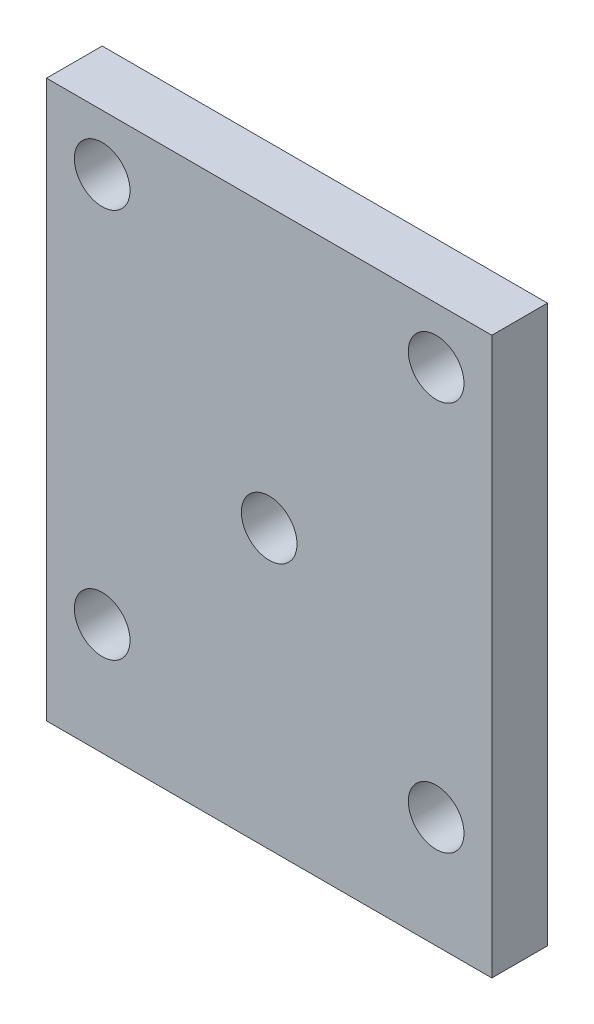
ISO-10303-21;
HEADER;
FILE_DESCRIPTION(('STEP AP214'),'2;1');
FILE_NAME('part.step','',(''),(''),'','','');
FILE_SCHEMA(('AUTOMOTIVE_DESIGN { 1 0 10303 214 1 1 1 1 }'));
ENDSEC;
DATA;
#1=APPLICATION_CONTEXT('core data for automotive mechanical design processes');
#2=APPLICATION_PROTOCOL_DEFINITION('international standard','automotive_design',2000,#1);
#3=PRODUCT_CONTEXT('',#1,'mechanical');
#4=PRODUCT('Part','Part','',(#3));
#5=PRODUCT_RELATED_PRODUCT_CATEGORY('part','',(#4));
#6=PRODUCT_DEFINITION_FORMATION('','',#4);
#7=PRODUCT_DEFINITION_CONTEXT('part definition',#1,'design');
#8=PRODUCT_DEFINITION('design','',#6,#7);
#9=PRODUCT_DEFINITION_SHAPE('','',#8);
#10=(LENGTH_UNIT() NAMED_UNIT(*) SI_UNIT(.MILLI.,.METRE.));
#11=(NAMED_UNIT(*) PLANE_ANGLE_UNIT() SI_UNIT($,.RADIAN.));
#12=(NAMED_UNIT(*) SI_UNIT($,.STERADIAN.) SOLID_ANGLE_UNIT());
#13=UNCERTAINTY_MEASURE_WITH_UNIT(LENGTH_MEASURE(1.E-05),#10,'distance_accuracy_value','');
#14=(GEOMETRIC_REPRESENTATION_CONTEXT(3) GLOBAL_UNCERTAINTY_ASSIGNED_CONTEXT((#13)) GLOBAL_UNIT_ASSIGNED_CONTEXT((#10,
#11,#12)) REPRESENTATION_CONTEXT('',''));
#15=CARTESIAN_POINT('',(0.,0.,0.));
#16=DIRECTION('',(0.,0.,1.));
#17=DIRECTION('',(1.,0.,0.));
#18=AXIS2_PLACEMENT_3D('',#15,#16,#17);
#19=CARTESIAN_POINT('',(0.,0.,19.05));
#20=DIRECTION('',(0.,1.,0.));
#21=DIRECTION('',(0.,0.,1.));
#22=AXIS2_PLACEMENT_3D('',#19,#20,#21);
#23=PLANE('',#22);
#24=DIRECTION('',(0.,0.,-1.));
#25=VECTOR('',#24,1.);
#26=CARTESIAN_POINT('',(0.,0.,19.05));
#27=LINE('',#26,#25);
#28=CARTESIAN_POINT('',(0.,0.,19.05));
#29=VERTEX_POINT('',#28);
#30=CARTESIAN_POINT('',(0.,0.,6.35));
#31=VERTEX_POINT('',#30);
#32=EDGE_CURVE('E11',#29,#31,#27,.T.);
#33=ORIENTED_EDGE('',*,*,#32,.T.);
#34=DIRECTION('',(-1.,0.,0.));
#35=VECTOR('',#34,1.);
#36=CARTESIAN_POINT('',(101.6,0.,6.35));
#37=LINE('',#36,#35);
#38=CARTESIAN_POINT('',(101.6,0.,6.35));
#39=VERTEX_POINT('',#38);
#40=EDGE_CURVE('E160',#39,#31,#37,.T.);
#41=ORIENTED_EDGE('',*,*,#40,.F.);
#42=DIRECTION('',(0.,0.,-1.));
#43=VECTOR('',#42,1.);
#44=CARTESIAN_POINT('',(101.6,0.,19.05));
#45=LINE('',#44,#43);
#46=CARTESIAN_POINT('',(101.6,0.,19.05));
#47=VERTEX_POINT('',#46);
#48=EDGE_CURVE('E48',#47,#39,#45,.T.);
#49=ORIENTED_EDGE('',*,*,#48,.F.);
#50=DIRECTION('',(1.,0.,0.));
#51=VECTOR('',#50,1.);
#52=CARTESIAN_POINT('',(0.,0.,19.05));
#53=LINE('',#52,#51);
#54=EDGE_CURVE('E140',#29,#47,#53,.T.);
#55=ORIENTED_EDGE('',*,*,#54,.F.);
#56=EDGE_LOOP('',(#33,#41,#49,#55));
#57=FACE_BOUND('',#56,.T.);
#58=ADVANCED_FACE('F40',(#57),#23,.F.);
#59=CARTESIAN_POINT('',(0.,127.,19.05));
#60=DIRECTION('',(0.,-1.,0.));
#61=DIRECTION('',(0.,0.,-1.));
#62=AXIS2_PLACEMENT_3D('',#59,#60,#61);
#63=PLANE('',#62);
#64=DIRECTION('',(1.,0.,0.));
#65=VECTOR('',#64,1.);
#66=CARTESIAN_POINT('',(101.6,127.,6.35));
#67=LINE('',#66,#65);
#68=CARTESIAN_POINT('',(0.,127.,6.35));
#69=VERTEX_POINT('',#68);
#70=CARTESIAN_POINT('',(101.6,127.,6.35));
#71=VERTEX_POINT('',#70);
#72=EDGE_CURVE('E141',#69,#71,#67,.T.);
#73=ORIENTED_EDGE('',*,*,#72,.F.);
#74=DIRECTION('',(0.,0.,-1.));
#75=VECTOR('',#74,1.);
#76=CARTESIAN_POINT('',(0.,127.,19.05));
#77=LINE('',#76,#75);
#78=CARTESIAN_POINT('',(0.,127.,19.05));
#79=VERTEX_POINT('',#78);
#80=EDGE_CURVE('E146',#79,#69,#77,.T.);
#81=ORIENTED_EDGE('',*,*,#80,.F.);
#82=DIRECTION('',(-1.,0.,0.));
#83=VECTOR('',#82,1.);
#84=CARTESIAN_POINT('',(0.,127.,19.05));
#85=LINE('',#84,#83);
#86=CARTESIAN_POINT('',(101.6,127.,19.05));
#87=VERTEX_POINT('',#86);
#88=EDGE_CURVE('E63',#87,#79,#85,.T.);
#89=ORIENTED_EDGE('',*,*,#88,.F.);
#90=DIRECTION('',(0.,0.,-1.));
#91=VECTOR('',#90,1.);
#92=CARTESIAN_POINT('',(101.6,127.,19.05));
#93=LINE('',#92,#91);
#94=EDGE_CURVE('E149',#87,#71,#93,.T.);
#95=ORIENTED_EDGE('',*,*,#94,.T.);
#96=EDGE_LOOP('',(#73,#81,#89,#95));
#97=FACE_BOUND('',#96,.T.);
#98=ADVANCED_FACE('F173',(#97),#63,.F.);
#99=CARTESIAN_POINT('',(0.,0.,19.05));
#100=DIRECTION('',(1.,0.,0.));
#101=DIRECTION('',(0.,0.,-1.));
#102=AXIS2_PLACEMENT_3D('',#99,#100,#101);
#103=PLANE('',#102);
#104=DIRECTION('',(0.,1.,0.));
#105=VECTOR('',#104,1.);
#106=CARTESIAN_POINT('',(0.,127.,6.35));
#107=LINE('',#106,#105);
#108=EDGE_CURVE('E131',#31,#69,#107,.T.);
#109=ORIENTED_EDGE('',*,*,#108,.F.);
#110=ORIENTED_EDGE('',*,*,#32,.F.);
#111=DIRECTION('',(0.,-1.,0.));
#112=VECTOR('',#111,1.);
#113=CARTESIAN_POINT('',(0.,0.,19.05));
#114=LINE('',#113,#112);
#115=EDGE_CURVE('E138',#79,#29,#114,.T.);
#116=ORIENTED_EDGE('',*,*,#115,.F.);
#117=ORIENTED_EDGE('',*,*,#80,.T.);
#118=EDGE_LOOP('',(#109,#110,#116,#117));
#119=FACE_BOUND('',#118,.T.);
#120=ADVANCED_FACE('F42',(#119),#103,.F.);
#121=CARTESIAN_POINT('',(101.6,0.,19.05));
#122=DIRECTION('',(-1.,0.,0.));
#123=DIRECTION('',(0.,0.,1.));
#124=AXIS2_PLACEMENT_3D('',#121,#122,#123);
#125=PLANE('',#124);
#126=DIRECTION('',(0.,-1.,0.));
#127=VECTOR('',#126,1.);
#128=CARTESIAN_POINT('',(101.6,127.,6.35));
#129=LINE('',#128,#127);
#130=EDGE_CURVE('E129',#71,#39,#129,.T.);
#131=ORIENTED_EDGE('',*,*,#130,.F.);
#132=ORIENTED_EDGE('',*,*,#94,.F.);
#133=DIRECTION('',(0.,1.,0.));
#134=VECTOR('',#133,1.);
#135=CARTESIAN_POINT('',(101.6,0.,19.05));
#136=LINE('',#135,#134);
#137=EDGE_CURVE('E143',#47,#87,#136,.T.);
#138=ORIENTED_EDGE('',*,*,#137,.F.);
#139=ORIENTED_EDGE('',*,*,#48,.T.);
#140=EDGE_LOOP('',(#131,#132,#138,#139));
#141=FACE_BOUND('',#140,.T.);
#142=ADVANCED_FACE('F156',(#141),#125,.F.);
#143=CARTESIAN_POINT('',(0.,0.,19.05));
#144=DIRECTION('',(0.,0.,-1.));
#145=DIRECTION('',(-1.,0.,0.));
#146=AXIS2_PLACEMENT_3D('',#143,#144,#145);
#147=PLANE('',#146);
#148=CARTESIAN_POINT('',(50.8,63.5,19.05));
#149=DIRECTION('',(0.,0.,1.));
#150=DIRECTION('',(1.,0.,0.));
#151=AXIS2_PLACEMENT_3D('',#148,#149,#150);
#152=CIRCLE('',#151,6.35);
#153=CARTESIAN_POINT('',(57.15,63.5,19.05));
#154=VERTEX_POINT('',#153);
#155=EDGE_CURVE('E351',#154,#154,#152,.T.);
#156=ORIENTED_EDGE('',*,*,#155,.F.);
#157=EDGE_LOOP('',(#156));
#158=FACE_BOUND('',#157,.T.);
#159=CARTESIAN_POINT('',(88.9,114.3,19.05));
#160=DIRECTION('',(0.,0.,1.));
#161=DIRECTION('',(-1.,0.,0.));
#162=AXIS2_PLACEMENT_3D('',#159,#160,#161);
#163=CIRCLE('',#162,6.35000000000001);
#164=CARTESIAN_POINT('',(82.55,114.3,19.05));
#165=VERTEX_POINT('',#164);
#166=EDGE_CURVE('E357',#165,#165,#163,.T.);
#167=ORIENTED_EDGE('',*,*,#166,.F.);
#168=EDGE_LOOP('',(#167));
#169=FACE_BOUND('',#168,.T.);
#170=CARTESIAN_POINT('',(88.9,25.4,19.05));
#171=DIRECTION('',(0.,0.,1.));
#172=DIRECTION('',(-1.,0.,0.));
#173=AXIS2_PLACEMENT_3D('',#170,#171,#172);
#174=CIRCLE('',#173,6.35000000000001);
#175=CARTESIAN_POINT('',(82.55,25.4,19.05));
#176=VERTEX_POINT('',#175);
#177=EDGE_CURVE('E374',#176,#176,#174,.T.);
#178=ORIENTED_EDGE('',*,*,#177,.F.);
#179=EDGE_LOOP('',(#178));
#180=FACE_BOUND('',#179,.T.);
#181=CARTESIAN_POINT('',(12.7,25.4,19.05));
#182=DIRECTION('',(0.,0.,1.));
#183=DIRECTION('',(1.,0.,0.));
#184=AXIS2_PLACEMENT_3D('',#181,#182,#183);
#185=CIRCLE('',#184,6.35);
#186=CARTESIAN_POINT('',(19.05,25.4,19.05));
#187=VERTEX_POINT('',#186);
#188=EDGE_CURVE('E368',#187,#187,#185,.T.);
#189=ORIENTED_EDGE('',*,*,#188,.F.);
#190=EDGE_LOOP('',(#189));
#191=FACE_BOUND('',#190,.T.);
#192=CARTESIAN_POINT('',(12.7,114.3,19.05));
#193=DIRECTION('',(0.,0.,1.));
#194=DIRECTION('',(1.,0.,0.));
#195=AXIS2_PLACEMENT_3D('',#192,#193,#194);
#196=CIRCLE('',#195,6.35);
#197=CARTESIAN_POINT('',(19.05,114.3,19.05));
#198=VERTEX_POINT('',#197);
#199=EDGE_CURVE('E136',#198,#198,#196,.T.);
#200=ORIENTED_EDGE('',*,*,#199,.F.);
#201=EDGE_LOOP('',(#200));
#202=FACE_BOUND('',#201,.T.);
#203=ORIENTED_EDGE('',*,*,#115,.T.);
#204=ORIENTED_EDGE('',*,*,#54,.T.);
#205=ORIENTED_EDGE('',*,*,#137,.T.);
#206=ORIENTED_EDGE('',*,*,#88,.T.);
#207=EDGE_LOOP('',(#203,#204,#205,#206));
#208=FACE_BOUND('',#207,.T.);
#209=ADVANCED_FACE('F176',(#158,#169,#180,#191,#202,#208),#147,.F.);
#210=CARTESIAN_POINT('',(0.,0.,0.));
#211=DIRECTION('',(0.,0.,-1.));
#212=DIRECTION('',(-1.,0.,0.));
#213=AXIS2_PLACEMENT_3D('',#210,#211,#212);
#214=PLANE('',#213);
#215=DIRECTION('',(1.,0.,0.));
#216=VECTOR('',#215,1.);
#217=CARTESIAN_POINT('',(76.2,50.8,0.));
#218=LINE('',#217,#216);
#219=CARTESIAN_POINT('',(25.4,50.8,0.));
#220=VERTEX_POINT('',#219);
#221=CARTESIAN_POINT('',(76.2,50.8,0.));
#222=VERTEX_POINT('',#221);
#223=EDGE_CURVE('E107',#220,#222,#218,.T.);
#224=ORIENTED_EDGE('',*,*,#223,.F.);
#225=DIRECTION('',(0.,-1.,0.));
#226=VECTOR('',#225,1.);
#227=CARTESIAN_POINT('',(25.4,127.,0.));
#228=LINE('',#227,#226);
#229=CARTESIAN_POINT('',(25.4,76.2,0.));
#230=VERTEX_POINT('',#229);
#231=EDGE_CURVE('E119',#230,#220,#228,.T.);
#232=ORIENTED_EDGE('',*,*,#231,.F.);
#233=DIRECTION('',(-1.,0.,0.));
#234=VECTOR('',#233,1.);
#235=CARTESIAN_POINT('',(76.2,76.2,0.));
#236=LINE('',#235,#234);
#237=CARTESIAN_POINT('',(76.2,76.2,0.));
#238=VERTEX_POINT('',#237);
#239=EDGE_CURVE('E122',#238,#230,#236,.T.);
#240=ORIENTED_EDGE('',*,*,#239,.F.);
#241=DIRECTION('',(0.,1.,0.));
#242=VECTOR('',#241,1.);
#243=CARTESIAN_POINT('',(76.2,127.,0.));
#244=LINE('',#243,#242);
#245=EDGE_CURVE('E121',#222,#238,#244,.T.);
#246=ORIENTED_EDGE('',*,*,#245,.F.);
#247=EDGE_LOOP('',(#224,#232,#240,#246));
#248=FACE_BOUND('',#247,.T.);
#249=ADVANCED_FACE('F117',(#248),#214,.T.);
#250=CARTESIAN_POINT('',(25.4,127.,6.35));
#251=DIRECTION('',(1.,0.,0.));
#252=DIRECTION('',(0.,1.,0.));
#253=AXIS2_PLACEMENT_3D('',#250,#251,#252);
#254=PLANE('',#253);
#255=ORIENTED_EDGE('',*,*,#231,.T.);
#256=DIRECTION('',(0.,0.,-1.));
#257=VECTOR('',#256,1.);
#258=CARTESIAN_POINT('',(25.4,50.8,78.1920489685532));
#259=LINE('',#258,#257);
#260=CARTESIAN_POINT('',(25.4,50.8,6.34999999999999));
#261=VERTEX_POINT('',#260);
#262=EDGE_CURVE('E104',#261,#220,#259,.T.);
#263=ORIENTED_EDGE('',*,*,#262,.F.);
#264=DIRECTION('',(0.,-1.,0.));
#265=VECTOR('',#264,1.);
#266=CARTESIAN_POINT('',(25.4,127.,6.35));
#267=LINE('',#266,#265);
#268=CARTESIAN_POINT('',(25.4,76.2,6.34999999999999));
#269=VERTEX_POINT('',#268);
#270=EDGE_CURVE('E127',#269,#261,#267,.T.);
#271=ORIENTED_EDGE('',*,*,#270,.F.);
#272=DIRECTION('',(0.,0.,-1.));
#273=VECTOR('',#272,1.);
#274=CARTESIAN_POINT('',(25.4,76.2,78.1920489685532));
#275=LINE('',#274,#273);
#276=EDGE_CURVE('E126',#269,#230,#275,.T.);
#277=ORIENTED_EDGE('',*,*,#276,.T.);
#278=EDGE_LOOP('',(#255,#263,#271,#277));
#279=FACE_BOUND('',#278,.T.);
#280=ADVANCED_FACE('F125',(#279),#254,.F.);
#281=CARTESIAN_POINT('',(76.2,127.,6.35));
#282=DIRECTION('',(-1.,0.,0.));
#283=DIRECTION('',(0.,0.,1.));
#284=AXIS2_PLACEMENT_3D('',#281,#282,#283);
#285=PLANE('',#284);
#286=DIRECTION('',(0.,1.,0.));
#287=VECTOR('',#286,1.);
#288=CARTESIAN_POINT('',(76.2,127.,6.35));
#289=LINE('',#288,#287);
#290=CARTESIAN_POINT('',(76.2,50.8,6.35));
#291=VERTEX_POINT('',#290);
#292=CARTESIAN_POINT('',(76.2,76.2,6.34999999999999));
#293=VERTEX_POINT('',#292);
#294=EDGE_CURVE('E164',#291,#293,#289,.T.);
#295=ORIENTED_EDGE('',*,*,#294,.F.);
#296=DIRECTION('',(0.,0.,-1.));
#297=VECTOR('',#296,1.);
#298=CARTESIAN_POINT('',(76.2,50.8,78.1920489685532));
#299=LINE('',#298,#297);
#300=EDGE_CURVE('E55',#291,#222,#299,.T.);
#301=ORIENTED_EDGE('',*,*,#300,.T.);
#302=ORIENTED_EDGE('',*,*,#245,.T.);
#303=DIRECTION('',(0.,0.,-1.));
#304=VECTOR('',#303,1.);
#305=CARTESIAN_POINT('',(76.2,76.2,78.1920489685532));
#306=LINE('',#305,#304);
#307=EDGE_CURVE('E360',#293,#238,#306,.T.);
#308=ORIENTED_EDGE('',*,*,#307,.F.);
#309=EDGE_LOOP('',(#295,#301,#302,#308));
#310=FACE_BOUND('',#309,.T.);
#311=ADVANCED_FACE('F277',(#310),#285,.F.);
#312=CARTESIAN_POINT('',(0.,0.,6.35));
#313=DIRECTION('',(0.,0.,-1.));
#314=DIRECTION('',(-1.,0.,0.));
#315=AXIS2_PLACEMENT_3D('',#312,#313,#314);
#316=PLANE('',#315);
#317=ORIENTED_EDGE('',*,*,#40,.T.);
#318=ORIENTED_EDGE('',*,*,#108,.T.);
#319=ORIENTED_EDGE('',*,*,#72,.T.);
#320=ORIENTED_EDGE('',*,*,#130,.T.);
#321=EDGE_LOOP('',(#317,#318,#319,#320));
#322=FACE_BOUND('',#321,.T.);
#323=CARTESIAN_POINT('',(88.9,114.3,6.35));
#324=DIRECTION('',(0.,0.,-1.));
#325=DIRECTION('',(-1.,0.,0.));
#326=AXIS2_PLACEMENT_3D('',#323,#324,#325);
#327=CIRCLE('',#326,6.35000000000001);
#328=CARTESIAN_POINT('',(82.55,114.3,6.35));
#329=VERTEX_POINT('',#328);
#330=EDGE_CURVE('E377',#329,#329,#327,.F.);
#331=ORIENTED_EDGE('',*,*,#330,.T.);
#332=EDGE_LOOP('',(#331));
#333=FACE_BOUND('',#332,.T.);
#334=CARTESIAN_POINT('',(88.9,25.4,6.35));
#335=DIRECTION('',(0.,0.,-1.));
#336=DIRECTION('',(-1.,0.,0.));
#337=AXIS2_PLACEMENT_3D('',#334,#335,#336);
#338=CIRCLE('',#337,6.35000000000001);
#339=CARTESIAN_POINT('',(82.55,25.4,6.35));
#340=VERTEX_POINT('',#339);
#341=EDGE_CURVE('E371',#340,#340,#338,.F.);
#342=ORIENTED_EDGE('',*,*,#341,.T.);
#343=EDGE_LOOP('',(#342));
#344=FACE_BOUND('',#343,.T.);
#345=ORIENTED_EDGE('',*,*,#270,.T.);
#346=DIRECTION('',(-1.,0.,0.));
#347=VECTOR('',#346,1.);
#348=CARTESIAN_POINT('',(76.2,50.8,6.34999999999999));
#349=LINE('',#348,#347);
#350=EDGE_CURVE('E108',#291,#261,#349,.T.);
#351=ORIENTED_EDGE('',*,*,#350,.F.);
#352=ORIENTED_EDGE('',*,*,#294,.T.);
#353=DIRECTION('',(1.,0.,0.));
#354=VECTOR('',#353,1.);
#355=CARTESIAN_POINT('',(76.2,76.2,6.34999999999999));
#356=LINE('',#355,#354);
#357=EDGE_CURVE('E350',#269,#293,#356,.T.);
#358=ORIENTED_EDGE('',*,*,#357,.F.);
#359=EDGE_LOOP('',(#345,#351,#352,#358));
#360=FACE_BOUND('',#359,.T.);
#361=CARTESIAN_POINT('',(12.7,25.4,6.35));
#362=DIRECTION('',(0.,0.,-1.));
#363=DIRECTION('',(-1.,0.,0.));
#364=AXIS2_PLACEMENT_3D('',#361,#362,#363);
#365=CIRCLE('',#364,6.35);
#366=CARTESIAN_POINT('',(6.35,25.4,6.35));
#367=VERTEX_POINT('',#366);
#368=EDGE_CURVE('E364',#367,#367,#365,.F.);
#369=ORIENTED_EDGE('',*,*,#368,.T.);
#370=EDGE_LOOP('',(#369));
#371=FACE_BOUND('',#370,.T.);
#372=CARTESIAN_POINT('',(12.7,114.3,6.35));
#373=DIRECTION('',(0.,0.,-1.));
#374=DIRECTION('',(-1.,0.,0.));
#375=AXIS2_PLACEMENT_3D('',#372,#373,#374);
#376=CIRCLE('',#375,6.35);
#377=CARTESIAN_POINT('',(6.35000000000001,114.3,6.35));
#378=VERTEX_POINT('',#377);
#379=EDGE_CURVE('E367',#378,#378,#376,.F.);
#380=ORIENTED_EDGE('',*,*,#379,.T.);
#381=EDGE_LOOP('',(#380));
#382=FACE_BOUND('',#381,.T.);
#383=ADVANCED_FACE('F170',(#322,#333,#344,#360,#371,#382),#316,.T.);
#384=CARTESIAN_POINT('',(88.9,25.4,-0.001000000000001));
#385=DIRECTION('',(0.,0.,1.));
#386=DIRECTION('',(1.,0.,0.));
#387=AXIS2_PLACEMENT_3D('',#384,#385,#386);
#388=CYLINDRICAL_SURFACE('',#387,6.35000000000001);
#389=ORIENTED_EDGE('',*,*,#341,.F.);
#390=EDGE_LOOP('',(#389));
#391=FACE_BOUND('',#390,.T.);
#392=ORIENTED_EDGE('',*,*,#177,.T.);
#393=EDGE_LOOP('',(#392));
#394=FACE_BOUND('',#393,.T.);
#395=ADVANCED_FACE('F209',(#391,#394),#388,.F.);
#396=CARTESIAN_POINT('',(88.9,114.3,-0.001000000000001));
#397=DIRECTION('',(0.,0.,1.));
#398=DIRECTION('',(1.,0.,0.));
#399=AXIS2_PLACEMENT_3D('',#396,#397,#398);
#400=CYLINDRICAL_SURFACE('',#399,6.35000000000001);
#401=ORIENTED_EDGE('',*,*,#330,.F.);
#402=EDGE_LOOP('',(#401));
#403=FACE_BOUND('',#402,.T.);
#404=ORIENTED_EDGE('',*,*,#166,.T.);
#405=EDGE_LOOP('',(#404));
#406=FACE_BOUND('',#405,.T.);
#407=ADVANCED_FACE('F214',(#403,#406),#400,.F.);
#408=CARTESIAN_POINT('',(12.7,114.3,-0.001000000000001));
#409=DIRECTION('',(0.,0.,1.));
#410=DIRECTION('',(1.,0.,0.));
#411=AXIS2_PLACEMENT_3D('',#408,#409,#410);
#412=CYLINDRICAL_SURFACE('',#411,6.35);
#413=ORIENTED_EDGE('',*,*,#379,.F.);
#414=EDGE_LOOP('',(#413));
#415=FACE_BOUND('',#414,.T.);
#416=ORIENTED_EDGE('',*,*,#199,.T.);
#417=EDGE_LOOP('',(#416));
#418=FACE_BOUND('',#417,.T.);
#419=ADVANCED_FACE('F227',(#415,#418),#412,.F.);
#420=CARTESIAN_POINT('',(12.7,25.4,-0.001000000000001));
#421=DIRECTION('',(0.,0.,1.));
#422=DIRECTION('',(1.,0.,0.));
#423=AXIS2_PLACEMENT_3D('',#420,#421,#422);
#424=CYLINDRICAL_SURFACE('',#423,6.35);
#425=ORIENTED_EDGE('',*,*,#368,.F.);
#426=EDGE_LOOP('',(#425));
#427=FACE_BOUND('',#426,.T.);
#428=ORIENTED_EDGE('',*,*,#188,.T.);
#429=EDGE_LOOP('',(#428));
#430=FACE_BOUND('',#429,.T.);
#431=ADVANCED_FACE('F238',(#427,#430),#424,.F.);
#432=CARTESIAN_POINT('',(76.2,76.2,78.1920489685532));
#433=DIRECTION('',(0.,-1.,0.));
#434=DIRECTION('',(0.,0.,-1.));
#435=AXIS2_PLACEMENT_3D('',#432,#433,#434);
#436=PLANE('',#435);
#437=ORIENTED_EDGE('',*,*,#357,.T.);
#438=ORIENTED_EDGE('',*,*,#307,.T.);
#439=ORIENTED_EDGE('',*,*,#239,.T.);
#440=ORIENTED_EDGE('',*,*,#276,.F.);
#441=EDGE_LOOP('',(#437,#438,#439,#440));
#442=FACE_BOUND('',#441,.T.);
#443=ADVANCED_FACE('F248',(#442),#436,.F.);
#444=CARTESIAN_POINT('',(76.2,50.8,78.1920489685532));
#445=DIRECTION('',(0.,1.,0.));
#446=DIRECTION('',(0.,0.,1.));
#447=AXIS2_PLACEMENT_3D('',#444,#445,#446);
#448=PLANE('',#447);
#449=ORIENTED_EDGE('',*,*,#350,.T.);
#450=ORIENTED_EDGE('',*,*,#262,.T.);
#451=ORIENTED_EDGE('',*,*,#223,.T.);
#452=ORIENTED_EDGE('',*,*,#300,.F.);
#453=EDGE_LOOP('',(#449,#450,#451,#452));
#454=FACE_BOUND('',#453,.T.);
#455=ADVANCED_FACE('F106',(#454),#448,.F.);
#456=CARTESIAN_POINT('',(50.8,63.5,9.525));
#457=DIRECTION('',(0.,0.,1.));
#458=DIRECTION('',(1.,0.,0.));
#459=AXIS2_PLACEMENT_3D('',#456,#457,#458);
#460=CYLINDRICAL_SURFACE('',#459,6.35);
#461=CARTESIAN_POINT('',(50.8,63.5,9.525));
#462=DIRECTION('',(0.,0.,1.));
#463=DIRECTION('',(1.,0.,0.));
#464=AXIS2_PLACEMENT_3D('',#461,#462,#463);
#465=CIRCLE('',#464,6.35);
#466=CARTESIAN_POINT('',(57.15,63.5,9.525));
#467=VERTEX_POINT('',#466);
#468=EDGE_CURVE('E349',#467,#467,#465,.T.);
#469=CARTESIAN_POINT('',(57.15,63.5,9.525));
#470=CARTESIAN_POINT('',(57.15,63.5,9.62421875));
#471=CARTESIAN_POINT('',(57.15,63.5,9.7234375));
#472=CARTESIAN_POINT('',(57.15,63.5,9.921875));
#473=CARTESIAN_POINT('',(57.15,63.5,10.02109375));
#474=CARTESIAN_POINT('',(57.15,63.5,10.21953125));
#475=CARTESIAN_POINT('',(57.15,63.5,10.31875));
#476=CARTESIAN_POINT('',(57.15,63.5,10.5171875));
#477=CARTESIAN_POINT('',(57.15,63.5,10.61640625));
#478=CARTESIAN_POINT('',(57.15,63.5,10.81484375));
#479=CARTESIAN_POINT('',(57.15,63.5,10.9140625));
#480=CARTESIAN_POINT('',(57.15,63.5,11.1125));
#481=CARTESIAN_POINT('',(57.15,63.5,11.21171875));
#482=CARTESIAN_POINT('',(57.15,63.5,11.41015625));
#483=CARTESIAN_POINT('',(57.15,63.5,11.509375));
#484=CARTESIAN_POINT('',(57.15,63.5,11.7078125));
#485=CARTESIAN_POINT('',(57.15,63.5,11.80703125));
#486=CARTESIAN_POINT('',(57.15,63.5,12.00546875));
#487=CARTESIAN_POINT('',(57.15,63.5,12.1046875));
#488=CARTESIAN_POINT('',(57.15,63.5,12.303125));
#489=CARTESIAN_POINT('',(57.15,63.5,12.40234375));
#490=CARTESIAN_POINT('',(57.15,63.5,12.60078125));
#491=CARTESIAN_POINT('',(57.15,63.5,12.7));
#492=CARTESIAN_POINT('',(57.15,63.5,12.8984375));
#493=CARTESIAN_POINT('',(57.15,63.5,12.99765625));
#494=CARTESIAN_POINT('',(57.15,63.5,13.19609375));
#495=CARTESIAN_POINT('',(57.15,63.5,13.2953125));
#496=CARTESIAN_POINT('',(57.15,63.5,13.49375));
#497=CARTESIAN_POINT('',(57.15,63.5,13.59296875));
#498=CARTESIAN_POINT('',(57.15,63.5,13.79140625));
#499=CARTESIAN_POINT('',(57.15,63.5,13.890625));
#500=CARTESIAN_POINT('',(57.15,63.5,14.0890625));
#501=CARTESIAN_POINT('',(57.15,63.5,14.18828125));
#502=CARTESIAN_POINT('',(57.15,63.5,14.38671875));
#503=CARTESIAN_POINT('',(57.15,63.5,14.4859375));
#504=CARTESIAN_POINT('',(57.15,63.5,14.684375));
#505=CARTESIAN_POINT('',(57.15,63.5,14.78359375));
#506=CARTESIAN_POINT('',(57.15,63.5,14.98203125));
#507=CARTESIAN_POINT('',(57.15,63.5,15.08125));
#508=CARTESIAN_POINT('',(57.15,63.5,15.2796875));
#509=CARTESIAN_POINT('',(57.15,63.5,15.37890625));
#510=CARTESIAN_POINT('',(57.15,63.5,15.57734375));
#511=CARTESIAN_POINT('',(57.15,63.5,15.6765625));
#512=CARTESIAN_POINT('',(57.15,63.5,15.875));
#513=CARTESIAN_POINT('',(57.15,63.5,15.97421875));
#514=CARTESIAN_POINT('',(57.15,63.5,16.17265625));
#515=CARTESIAN_POINT('',(57.15,63.5,16.271875));
#516=CARTESIAN_POINT('',(57.15,63.5,16.4703125));
#517=CARTESIAN_POINT('',(57.15,63.5,16.56953125));
#518=CARTESIAN_POINT('',(57.15,63.5,16.76796875));
#519=CARTESIAN_POINT('',(57.15,63.5,16.8671875));
#520=CARTESIAN_POINT('',(57.15,63.5,17.065625));
#521=CARTESIAN_POINT('',(57.15,63.5,17.16484375));
#522=CARTESIAN_POINT('',(57.15,63.5,17.36328125));
#523=CARTESIAN_POINT('',(57.15,63.5,17.4625));
#524=CARTESIAN_POINT('',(57.15,63.5,17.6609375));
#525=CARTESIAN_POINT('',(57.15,63.5,17.76015625));
#526=CARTESIAN_POINT('',(57.15,63.5,17.95859375));
#527=CARTESIAN_POINT('',(57.15,63.5,18.0578125));
#528=CARTESIAN_POINT('',(57.15,63.5,18.25625));
#529=CARTESIAN_POINT('',(57.15,63.5,18.35546875));
#530=CARTESIAN_POINT('',(57.15,63.5,18.55390625));
#531=CARTESIAN_POINT('',(57.15,63.5,18.653125));
#532=CARTESIAN_POINT('',(57.15,63.5,18.8515625));
#533=CARTESIAN_POINT('',(57.15,63.5,18.95078125));
#534=CARTESIAN_POINT('',(57.15,63.5,19.05));
#535=B_SPLINE_CURVE_WITH_KNOTS('',3,(#469,#470,#471,#472,#473,#474,#475,#476,#477,#478,#479,
#480,#481,#482,#483,#484,#485,#486,#487,#488,#489,#490,#491,#492,#493,#494,#495,#496,#497,#498,
#499,#500,#501,#502,#503,#504,#505,#506,#507,#508,#509,#510,#511,#512,#513,#514,#515,#516,#517,
#518,#519,#520,#521,#522,#523,#524,#525,#526,#527,#528,#529,#530,#531,#532,#533,#534),
.UNSPECIFIED.,.F.,.F.,(4,2,2,2,2,2,2,2,2,2,2,2,2,2,2,2,2,2,2,2,2,2,2,2,2,2,2,2,2,2,2,2,4),(0.,
0.29765625,0.5953125,0.892968750000001,1.190625,1.48828125,1.7859375,2.08359375,2.38125,
2.67890625,2.9765625,3.27421875,3.571875,3.86953125,4.1671875,4.46484375,4.7625,5.06015625,
5.3578125,5.65546875,5.953125,6.25078125,6.5484375,6.84609375,7.14375,7.44140625,7.7390625,
8.03671875,8.334375,8.63203125,8.9296875,9.22734375,9.525),.UNSPECIFIED.);
#536=EDGE_CURVE('BSEAM312',#467,#154,#535,.T.);
#537=ORIENTED_EDGE('',*,*,#468,.F.);
#538=ORIENTED_EDGE('',*,*,#155,.T.);
#539=ORIENTED_EDGE('',*,*,#536,.T.);
#540=ORIENTED_EDGE('',*,*,#536,.F.);
#541=EDGE_LOOP('',(#537,#539,#538,#540));
#542=FACE_BOUND('',#541,.T.);
#543=ADVANCED_FACE('F312',(#542),#460,.F.);
#544=CARTESIAN_POINT('',(50.8,63.5,9.525));
#545=DIRECTION('',(0.,0.,1.));
#546=DIRECTION('',(1.,0.,0.));
#547=AXIS2_PLACEMENT_3D('',#544,#545,#546);
#548=PLANE('',#547);
#549=ORIENTED_EDGE('',*,*,#468,.T.);
#550=EDGE_LOOP('',(#549));
#551=FACE_BOUND('',#550,.T.);
#552=ADVANCED_FACE('F327',(#551),#548,.T.);
#553=CLOSED_SHELL('',(#58,#98,#120,#142,#209,#249,#280,#311,#383,#395,#407,#419,#431,#443,#455,
#543,#552));
#554=MANIFOLD_SOLID_BREP('B2',#553);
#555=ADVANCED_BREP_SHAPE_REPRESENTATION('',(#18,#554),#14);
#556=SHAPE_DEFINITION_REPRESENTATION(#9,#555);
ENDSEC;
END-ISO-10303-21;
